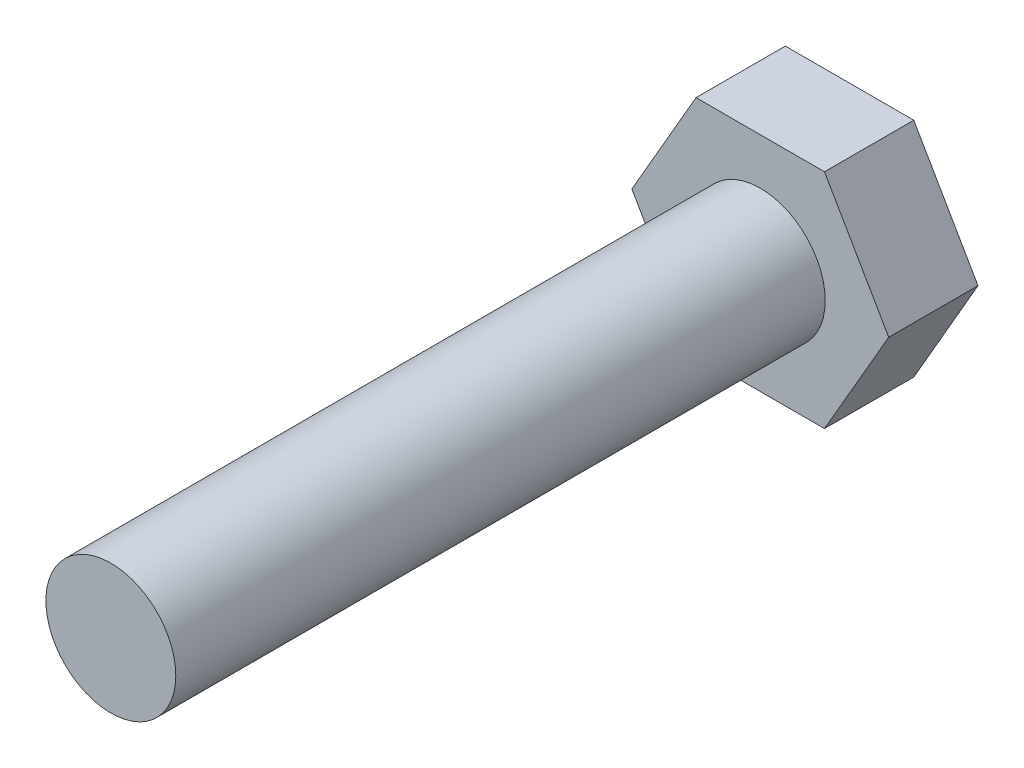
ISO-10303-21;
HEADER;
FILE_DESCRIPTION(('STEP AP214'),'2;1');
FILE_NAME('part.step','',(''),(''),'','','');
FILE_SCHEMA(('AUTOMOTIVE_DESIGN { 1 0 10303 214 1 1 1 1 }'));
ENDSEC;
DATA;
#1=APPLICATION_CONTEXT('core data for automotive mechanical design processes');
#2=APPLICATION_PROTOCOL_DEFINITION('international standard','automotive_design',2000,#1);
#3=PRODUCT_CONTEXT('',#1,'mechanical');
#4=PRODUCT('Part','Part','',(#3));
#5=PRODUCT_RELATED_PRODUCT_CATEGORY('part','',(#4));
#6=PRODUCT_DEFINITION_FORMATION('','',#4);
#7=PRODUCT_DEFINITION_CONTEXT('part definition',#1,'design');
#8=PRODUCT_DEFINITION('design','',#6,#7);
#9=PRODUCT_DEFINITION_SHAPE('','',#8);
#10=(LENGTH_UNIT() NAMED_UNIT(*) SI_UNIT(.MILLI.,.METRE.));
#11=(NAMED_UNIT(*) PLANE_ANGLE_UNIT() SI_UNIT($,.RADIAN.));
#12=(NAMED_UNIT(*) SI_UNIT($,.STERADIAN.) SOLID_ANGLE_UNIT());
#13=UNCERTAINTY_MEASURE_WITH_UNIT(LENGTH_MEASURE(1.E-05),#10,'distance_accuracy_value','');
#14=(GEOMETRIC_REPRESENTATION_CONTEXT(3) GLOBAL_UNCERTAINTY_ASSIGNED_CONTEXT((#13)) GLOBAL_UNIT_ASSIGNED_CONTEXT((#10,
#11,#12)) REPRESENTATION_CONTEXT('',''));
#15=CARTESIAN_POINT('',(0.,0.,0.));
#16=DIRECTION('',(0.,0.,1.));
#17=DIRECTION('',(1.,0.,0.));
#18=AXIS2_PLACEMENT_3D('',#15,#16,#17);
#19=CARTESIAN_POINT('',(1.9774246719745,-3.42499999999996,2.75));
#20=DIRECTION('',(-0.866025403784442,0.499999999999995,0.));
#21=DIRECTION('',(-0.499999999999995,-0.866025403784442,0.));
#22=AXIS2_PLACEMENT_3D('',#19,#20,#21);
#23=PLANE('',#22);
#24=DIRECTION('',(0.499999999999995,0.866025403784441,0.));
#25=VECTOR('',#24,1.);
#26=CARTESIAN_POINT('',(1.9774246719745,-3.42499999999996,0.));
#27=LINE('',#26,#25);
#28=CARTESIAN_POINT('',(1.9774246719745,-3.42499999999996,0.));
#29=VERTEX_POINT('',#28);
#30=CARTESIAN_POINT('',(3.95484934394892,0.,0.));
#31=VERTEX_POINT('',#30);
#32=EDGE_CURVE('E125',#29,#31,#27,.T.);
#33=ORIENTED_EDGE('',*,*,#32,.T.);
#34=DIRECTION('',(0.,0.,-1.));
#35=VECTOR('',#34,1.);
#36=CARTESIAN_POINT('',(3.95484934394892,0.,2.75));
#37=LINE('',#36,#35);
#38=CARTESIAN_POINT('',(3.95484934394892,0.,2.75));
#39=VERTEX_POINT('',#38);
#40=EDGE_CURVE('E42',#39,#31,#37,.T.);
#41=ORIENTED_EDGE('',*,*,#40,.F.);
#42=DIRECTION('',(0.499999999999995,0.866025403784441,0.));
#43=VECTOR('',#42,1.);
#44=CARTESIAN_POINT('',(1.9774246719745,-3.42499999999996,2.75));
#45=LINE('',#44,#43);
#46=CARTESIAN_POINT('',(1.9774246719745,-3.42499999999996,2.75));
#47=VERTEX_POINT('',#46);
#48=EDGE_CURVE('E136',#47,#39,#45,.T.);
#49=ORIENTED_EDGE('',*,*,#48,.F.);
#50=DIRECTION('',(0.,0.,-1.));
#51=VECTOR('',#50,1.);
#52=CARTESIAN_POINT('',(1.9774246719745,-3.42499999999996,2.75));
#53=LINE('',#52,#51);
#54=EDGE_CURVE('E121',#47,#29,#53,.T.);
#55=ORIENTED_EDGE('',*,*,#54,.T.);
#56=EDGE_LOOP('',(#33,#41,#49,#55));
#57=FACE_BOUND('',#56,.T.);
#58=ADVANCED_FACE('F39',(#57),#23,.F.);
#59=CARTESIAN_POINT('',(3.95484934394892,0.,2.75));
#60=DIRECTION('',(-0.866025403784438,-0.500000000000001,0.));
#61=DIRECTION('',(0.500000000000001,-0.866025403784438,0.));
#62=AXIS2_PLACEMENT_3D('',#59,#60,#61);
#63=PLANE('',#62);
#64=DIRECTION('',(-0.500000000000001,0.866025403784438,0.));
#65=VECTOR('',#64,1.);
#66=CARTESIAN_POINT('',(3.95484934394892,0.,0.));
#67=LINE('',#66,#65);
#68=CARTESIAN_POINT('',(1.97742467197445,3.42499999999999,0.));
#69=VERTEX_POINT('',#68);
#70=EDGE_CURVE('E128',#31,#69,#67,.T.);
#71=ORIENTED_EDGE('',*,*,#70,.T.);
#72=DIRECTION('',(0.,0.,-1.));
#73=VECTOR('',#72,1.);
#74=CARTESIAN_POINT('',(1.97742467197445,3.42499999999999,2.75));
#75=LINE('',#74,#73);
#76=CARTESIAN_POINT('',(1.97742467197445,3.42499999999999,2.75));
#77=VERTEX_POINT('',#76);
#78=EDGE_CURVE('E139',#77,#69,#75,.T.);
#79=ORIENTED_EDGE('',*,*,#78,.F.);
#80=DIRECTION('',(-0.500000000000001,0.866025403784438,0.));
#81=VECTOR('',#80,1.);
#82=CARTESIAN_POINT('',(3.95484934394892,0.,2.75));
#83=LINE('',#82,#81);
#84=EDGE_CURVE('E94',#39,#77,#83,.T.);
#85=ORIENTED_EDGE('',*,*,#84,.F.);
#86=ORIENTED_EDGE('',*,*,#40,.T.);
#87=EDGE_LOOP('',(#71,#79,#85,#86));
#88=FACE_BOUND('',#87,.T.);
#89=ADVANCED_FACE('F144',(#88),#63,.F.);
#90=CARTESIAN_POINT('',(1.97742467197445,3.42499999999999,2.75));
#91=DIRECTION('',(0.,-1.,0.));
#92=DIRECTION('',(1.,0.,0.));
#93=AXIS2_PLACEMENT_3D('',#90,#91,#92);
#94=PLANE('',#93);
#95=DIRECTION('',(-1.,0.,0.));
#96=VECTOR('',#95,1.);
#97=CARTESIAN_POINT('',(1.97742467197445,3.42499999999999,0.));
#98=LINE('',#97,#96);
#99=CARTESIAN_POINT('',(-1.97742467197447,3.42499999999997,0.));
#100=VERTEX_POINT('',#99);
#101=EDGE_CURVE('E131',#69,#100,#98,.T.);
#102=ORIENTED_EDGE('',*,*,#101,.T.);
#103=DIRECTION('',(0.,0.,-1.));
#104=VECTOR('',#103,1.);
#105=CARTESIAN_POINT('',(-1.97742467197447,3.42499999999997,2.75));
#106=LINE('',#105,#104);
#107=CARTESIAN_POINT('',(-1.97742467197447,3.42499999999997,2.75));
#108=VERTEX_POINT('',#107);
#109=EDGE_CURVE('E116',#108,#100,#106,.T.);
#110=ORIENTED_EDGE('',*,*,#109,.F.);
#111=DIRECTION('',(-1.,0.,0.));
#112=VECTOR('',#111,1.);
#113=CARTESIAN_POINT('',(1.97742467197445,3.42499999999999,2.75));
#114=LINE('',#113,#112);
#115=EDGE_CURVE('E107',#77,#108,#114,.T.);
#116=ORIENTED_EDGE('',*,*,#115,.F.);
#117=ORIENTED_EDGE('',*,*,#78,.T.);
#118=EDGE_LOOP('',(#102,#110,#116,#117));
#119=FACE_BOUND('',#118,.T.);
#120=ADVANCED_FACE('F150',(#119),#94,.F.);
#121=CARTESIAN_POINT('',(-1.97742467197447,3.42499999999997,2.75));
#122=DIRECTION('',(0.866025403784442,-0.499999999999995,0.));
#123=DIRECTION('',(0.499999999999995,0.866025403784442,0.));
#124=AXIS2_PLACEMENT_3D('',#121,#122,#123);
#125=PLANE('',#124);
#126=DIRECTION('',(-0.499999999999995,-0.866025403784442,0.));
#127=VECTOR('',#126,1.);
#128=CARTESIAN_POINT('',(-1.97742467197447,3.42499999999997,0.));
#129=LINE('',#128,#127);
#130=CARTESIAN_POINT('',(-3.95484934394892,0.,0.));
#131=VERTEX_POINT('',#130);
#132=EDGE_CURVE('E115',#100,#131,#129,.T.);
#133=ORIENTED_EDGE('',*,*,#132,.T.);
#134=DIRECTION('',(0.,0.,-1.));
#135=VECTOR('',#134,1.);
#136=CARTESIAN_POINT('',(-3.95484934394892,0.,2.75));
#137=LINE('',#136,#135);
#138=CARTESIAN_POINT('',(-3.95484934394892,0.,2.75));
#139=VERTEX_POINT('',#138);
#140=EDGE_CURVE('E112',#139,#131,#137,.T.);
#141=ORIENTED_EDGE('',*,*,#140,.F.);
#142=DIRECTION('',(-0.499999999999995,-0.866025403784442,0.));
#143=VECTOR('',#142,1.);
#144=CARTESIAN_POINT('',(-1.97742467197447,3.42499999999997,2.75));
#145=LINE('',#144,#143);
#146=EDGE_CURVE('E101',#108,#139,#145,.T.);
#147=ORIENTED_EDGE('',*,*,#146,.F.);
#148=ORIENTED_EDGE('',*,*,#109,.T.);
#149=EDGE_LOOP('',(#133,#141,#147,#148));
#150=FACE_BOUND('',#149,.T.);
#151=ADVANCED_FACE('F113',(#150),#125,.F.);
#152=CARTESIAN_POINT('',(-3.95484934394892,0.,2.75));
#153=DIRECTION('',(0.866025403784435,0.500000000000007,0.));
#154=DIRECTION('',(-0.500000000000007,0.866025403784435,0.));
#155=AXIS2_PLACEMENT_3D('',#152,#153,#154);
#156=PLANE('',#155);
#157=DIRECTION('',(0.500000000000007,-0.866025403784435,0.));
#158=VECTOR('',#157,1.);
#159=CARTESIAN_POINT('',(-3.95484934394892,0.,0.));
#160=LINE('',#159,#158);
#161=CARTESIAN_POINT('',(-1.97742467197443,-3.425,0.));
#162=VERTEX_POINT('',#161);
#163=EDGE_CURVE('E79',#131,#162,#160,.T.);
#164=ORIENTED_EDGE('',*,*,#163,.T.);
#165=DIRECTION('',(0.,0.,-1.));
#166=VECTOR('',#165,1.);
#167=CARTESIAN_POINT('',(-1.97742467197443,-3.425,2.75));
#168=LINE('',#167,#166);
#169=CARTESIAN_POINT('',(-1.97742467197443,-3.425,2.75));
#170=VERTEX_POINT('',#169);
#171=EDGE_CURVE('E117',#170,#162,#168,.T.);
#172=ORIENTED_EDGE('',*,*,#171,.F.);
#173=DIRECTION('',(0.500000000000007,-0.866025403784435,0.));
#174=VECTOR('',#173,1.);
#175=CARTESIAN_POINT('',(-3.95484934394892,0.,2.75));
#176=LINE('',#175,#174);
#177=EDGE_CURVE('E105',#139,#170,#176,.T.);
#178=ORIENTED_EDGE('',*,*,#177,.F.);
#179=ORIENTED_EDGE('',*,*,#140,.T.);
#180=EDGE_LOOP('',(#164,#172,#178,#179));
#181=FACE_BOUND('',#180,.T.);
#182=ADVANCED_FACE('F119',(#181),#156,.F.);
#183=CARTESIAN_POINT('',(-1.97742467197443,-3.425,2.75));
#184=DIRECTION('',(0.,1.,0.));
#185=DIRECTION('',(-1.,0.,0.));
#186=AXIS2_PLACEMENT_3D('',#183,#184,#185);
#187=PLANE('',#186);
#188=DIRECTION('',(1.,0.,0.));
#189=VECTOR('',#188,1.);
#190=CARTESIAN_POINT('',(-1.97742467197443,-3.425,0.));
#191=LINE('',#190,#189);
#192=EDGE_CURVE('E85',#162,#29,#191,.T.);
#193=ORIENTED_EDGE('',*,*,#192,.T.);
#194=ORIENTED_EDGE('',*,*,#54,.F.);
#195=DIRECTION('',(1.,0.,0.));
#196=VECTOR('',#195,1.);
#197=CARTESIAN_POINT('',(-1.97742467197443,-3.425,2.75));
#198=LINE('',#197,#196);
#199=EDGE_CURVE('E56',#170,#47,#198,.T.);
#200=ORIENTED_EDGE('',*,*,#199,.F.);
#201=ORIENTED_EDGE('',*,*,#171,.T.);
#202=EDGE_LOOP('',(#193,#194,#200,#201));
#203=FACE_BOUND('',#202,.T.);
#204=ADVANCED_FACE('F166',(#203),#187,.F.);
#205=CARTESIAN_POINT('',(0.,0.,2.75));
#206=DIRECTION('',(0.,0.,1.));
#207=DIRECTION('',(1.,0.,0.));
#208=AXIS2_PLACEMENT_3D('',#205,#206,#207);
#209=PLANE('',#208);
#210=CARTESIAN_POINT('',(0.,0.,2.75));
#211=DIRECTION('',(0.,0.,1.));
#212=DIRECTION('',(1.,0.,0.));
#213=AXIS2_PLACEMENT_3D('',#210,#211,#212);
#214=CIRCLE('',#213,2.);
#215=CARTESIAN_POINT('',(2.,0.,2.75));
#216=VERTEX_POINT('',#215);
#217=EDGE_CURVE('E11',#216,#216,#214,.T.);
#218=ORIENTED_EDGE('',*,*,#217,.F.);
#219=EDGE_LOOP('',(#218));
#220=FACE_BOUND('',#219,.T.);
#221=ORIENTED_EDGE('',*,*,#48,.T.);
#222=ORIENTED_EDGE('',*,*,#84,.T.);
#223=ORIENTED_EDGE('',*,*,#115,.T.);
#224=ORIENTED_EDGE('',*,*,#146,.T.);
#225=ORIENTED_EDGE('',*,*,#177,.T.);
#226=ORIENTED_EDGE('',*,*,#199,.T.);
#227=EDGE_LOOP('',(#221,#222,#223,#224,#225,#226));
#228=FACE_BOUND('',#227,.T.);
#229=ADVANCED_FACE('F103',(#220,#228),#209,.T.);
#230=CARTESIAN_POINT('',(0.,0.,0.));
#231=DIRECTION('',(0.,0.,1.));
#232=DIRECTION('',(1.,0.,0.));
#233=AXIS2_PLACEMENT_3D('',#230,#231,#232);
#234=PLANE('',#233);
#235=ORIENTED_EDGE('',*,*,#32,.F.);
#236=ORIENTED_EDGE('',*,*,#192,.F.);
#237=ORIENTED_EDGE('',*,*,#163,.F.);
#238=ORIENTED_EDGE('',*,*,#132,.F.);
#239=ORIENTED_EDGE('',*,*,#101,.F.);
#240=ORIENTED_EDGE('',*,*,#70,.F.);
#241=EDGE_LOOP('',(#235,#236,#237,#238,#239,#240));
#242=FACE_BOUND('',#241,.T.);
#243=ADVANCED_FACE('F149',(#242),#234,.F.);
#244=CARTESIAN_POINT('',(0.,0.,22.75));
#245=DIRECTION('',(0.,0.,-1.));
#246=DIRECTION('',(-1.,0.,0.));
#247=AXIS2_PLACEMENT_3D('',#244,#245,#246);
#248=CYLINDRICAL_SURFACE('',#247,2.);
#249=CARTESIAN_POINT('',(0.,0.,22.75));
#250=DIRECTION('',(0.,0.,1.));
#251=DIRECTION('',(1.,0.,0.));
#252=AXIS2_PLACEMENT_3D('',#249,#250,#251);
#253=CIRCLE('',#252,2.);
#254=CARTESIAN_POINT('',(2.,0.,22.75));
#255=VERTEX_POINT('',#254);
#256=EDGE_CURVE('E129',#255,#255,#253,.T.);
#257=ORIENTED_EDGE('',*,*,#256,.F.);
#258=EDGE_LOOP('',(#257));
#259=FACE_BOUND('',#258,.T.);
#260=ORIENTED_EDGE('',*,*,#217,.T.);
#261=EDGE_LOOP('',(#260));
#262=FACE_BOUND('',#261,.T.);
#263=ADVANCED_FACE('F159',(#259,#262),#248,.T.);
#264=CARTESIAN_POINT('',(0.,0.,22.75));
#265=DIRECTION('',(0.,0.,1.));
#266=DIRECTION('',(1.,0.,0.));
#267=AXIS2_PLACEMENT_3D('',#264,#265,#266);
#268=PLANE('',#267);
#269=ORIENTED_EDGE('',*,*,#256,.T.);
#270=EDGE_LOOP('',(#269));
#271=FACE_BOUND('',#270,.T.);
#272=ADVANCED_FACE('F157',(#271),#268,.T.);
#273=CLOSED_SHELL('',(#58,#89,#120,#151,#182,#204,#229,#243,#263,#272));
#274=MANIFOLD_SOLID_BREP('B2',#273);
#275=ADVANCED_BREP_SHAPE_REPRESENTATION('',(#18,#274),#14);
#276=SHAPE_DEFINITION_REPRESENTATION(#9,#275);
ENDSEC;
END-ISO-10303-21;
